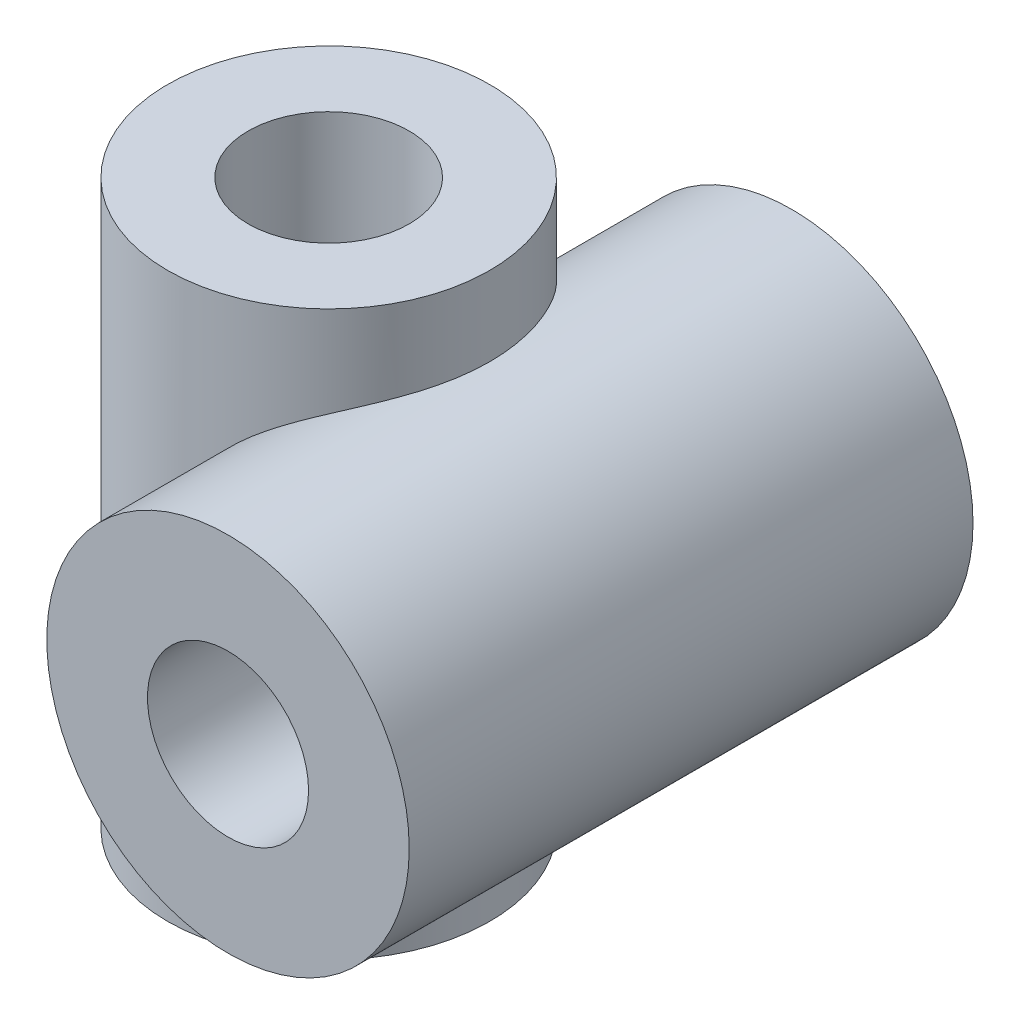
ISO-10303-21;
HEADER;
FILE_DESCRIPTION(('STEP AP214'),'2;1');
FILE_NAME('part.step','',(''),(''),'','','');
FILE_SCHEMA(('AUTOMOTIVE_DESIGN { 1 0 10303 214 1 1 1 1 }'));
ENDSEC;
DATA;
#1=APPLICATION_CONTEXT('core data for automotive mechanical design processes');
#2=APPLICATION_PROTOCOL_DEFINITION('international standard','automotive_design',2000,#1);
#3=PRODUCT_CONTEXT('',#1,'mechanical');
#4=PRODUCT('Part','Part','',(#3));
#5=PRODUCT_RELATED_PRODUCT_CATEGORY('part','',(#4));
#6=PRODUCT_DEFINITION_FORMATION('','',#4);
#7=PRODUCT_DEFINITION_CONTEXT('part definition',#1,'design');
#8=PRODUCT_DEFINITION('design','',#6,#7);
#9=PRODUCT_DEFINITION_SHAPE('','',#8);
#10=(LENGTH_UNIT() NAMED_UNIT(*) SI_UNIT(.MILLI.,.METRE.));
#11=(NAMED_UNIT(*) PLANE_ANGLE_UNIT() SI_UNIT($,.RADIAN.));
#12=(NAMED_UNIT(*) SI_UNIT($,.STERADIAN.) SOLID_ANGLE_UNIT());
#13=UNCERTAINTY_MEASURE_WITH_UNIT(LENGTH_MEASURE(1.E-05),#10,'distance_accuracy_value','');
#14=(GEOMETRIC_REPRESENTATION_CONTEXT(3) GLOBAL_UNCERTAINTY_ASSIGNED_CONTEXT((#13)) GLOBAL_UNIT_ASSIGNED_CONTEXT((#10,
#11,#12)) REPRESENTATION_CONTEXT('',''));
#15=CARTESIAN_POINT('',(0.,0.,0.));
#16=DIRECTION('',(0.,0.,1.));
#17=DIRECTION('',(1.,0.,0.));
#18=AXIS2_PLACEMENT_3D('',#15,#16,#17);
#19=CARTESIAN_POINT('',(5.3483924371836,42.5780961405475,-8.07880446123565E-06));
#20=DIRECTION('',(0.,1.,0.));
#21=DIRECTION('',(0.,0.,1.));
#22=AXIS2_PLACEMENT_3D('',#19,#20,#21);
#23=PLANE('',#22);
#24=CARTESIAN_POINT('',(5.3483924371836,42.5780961405475,-8.07880446123565E-06));
#25=DIRECTION('',(0.,1.,0.));
#26=DIRECTION('',(0.,0.,1.));
#27=AXIS2_PLACEMENT_3D('',#24,#25,#26);
#28=CIRCLE('',#27,8.);
#29=CARTESIAN_POINT('',(5.3483924371836,42.5780961405475,7.99999192119554));
#30=VERTEX_POINT('',#29);
#31=EDGE_CURVE('E10',#30,#30,#28,.T.);
#32=ORIENTED_EDGE('',*,*,#31,.T.);
#33=EDGE_LOOP('',(#32));
#34=FACE_BOUND('',#33,.T.);
#35=CARTESIAN_POINT('',(5.3483924371836,42.5780961405475,-8.07880446123565E-06));
#36=DIRECTION('',(0.,1.,0.));
#37=DIRECTION('',(0.,0.,1.));
#38=AXIS2_PLACEMENT_3D('',#35,#36,#37);
#39=CIRCLE('',#38,4.);
#40=CARTESIAN_POINT('',(5.3483924371836,42.5780961405475,3.99999192119554));
#41=VERTEX_POINT('',#40);
#42=EDGE_CURVE('E50',#41,#41,#39,.T.);
#43=ORIENTED_EDGE('',*,*,#42,.F.);
#44=EDGE_LOOP('',(#43));
#45=FACE_BOUND('',#44,.T.);
#46=ADVANCED_FACE('F36',(#34,#45),#23,.T.);
#47=CARTESIAN_POINT('',(5.3483924371836,14.5780961405475,-8.07880446123565E-06));
#48=DIRECTION('',(0.,1.,0.));
#49=DIRECTION('',(0.,0.,1.));
#50=AXIS2_PLACEMENT_3D('',#47,#48,#49);
#51=PLANE('',#50);
#52=CARTESIAN_POINT('',(5.3483924371836,14.5780961405475,-8.07880446123565E-06));
#53=DIRECTION('',(0.,1.,0.));
#54=DIRECTION('',(0.,0.,1.));
#55=AXIS2_PLACEMENT_3D('',#52,#53,#54);
#56=CIRCLE('',#55,8.);
#57=CARTESIAN_POINT('',(5.3483924371836,14.5780961405475,7.99999192119554));
#58=VERTEX_POINT('',#57);
#59=EDGE_CURVE('E41',#58,#58,#56,.T.);
#60=ORIENTED_EDGE('',*,*,#59,.F.);
#61=EDGE_LOOP('',(#60));
#62=FACE_BOUND('',#61,.T.);
#63=CARTESIAN_POINT('',(5.3483924371836,14.5780961405475,-8.07880446123565E-06));
#64=DIRECTION('',(0.,1.,0.));
#65=DIRECTION('',(0.,0.,1.));
#66=AXIS2_PLACEMENT_3D('',#63,#64,#65);
#67=CIRCLE('',#66,4.);
#68=CARTESIAN_POINT('',(5.3483924371836,14.5780961405475,3.99999192119554));
#69=VERTEX_POINT('',#68);
#70=EDGE_CURVE('E52',#69,#69,#67,.T.);
#71=ORIENTED_EDGE('',*,*,#70,.T.);
#72=EDGE_LOOP('',(#71));
#73=FACE_BOUND('',#72,.T.);
#74=ADVANCED_FACE('F83',(#62,#73),#51,.F.);
#75=CARTESIAN_POINT('',(5.3483924371836,42.5780961405475,-8.07880446123565E-06));
#76=DIRECTION('',(0.,-1.,0.));
#77=DIRECTION('',(0.,0.,-1.));
#78=AXIS2_PLACEMENT_3D('',#75,#76,#77);
#79=CYLINDRICAL_SURFACE('',#78,8.);
#80=CARTESIAN_POINT('',(5.3483924371836,29.7071454982904,-8.00000807880446));
#81=CARTESIAN_POINT('',(5.34839171642206,29.4562219147602,-8.00000636246614));
#82=CARTESIAN_POINT('',(5.35889141441208,29.2053134726397,-8.00002828869413));
#83=CARTESIAN_POINT('',(5.40082152134282,28.705165610582,-7.99986412057503));
#84=CARTESIAN_POINT('',(5.43225838156215,28.4559267289951,-7.99967796209969));
#85=CARTESIAN_POINT('',(5.51592120225961,27.9605299775816,-7.99836309516809));
#86=CARTESIAN_POINT('',(5.56818242743437,27.7143780684495,-7.99723278427369));
#87=CARTESIAN_POINT('',(5.69311709161706,27.2273465032014,-7.99282162272182));
#88=CARTESIAN_POINT('',(5.76578887376979,26.9864664208476,-7.98954094659441));
#89=CARTESIAN_POINT('',(5.93116141595478,26.5112694723611,-7.97918427438733));
#90=CARTESIAN_POINT('',(6.02389807955738,26.2769652331269,-7.97210144073448));
#91=CARTESIAN_POINT('',(6.2285966678794,25.817126160975,-7.9521028214573));
#92=CARTESIAN_POINT('',(6.3405602103225,25.5915920679256,-7.93918654486576));
#93=CARTESIAN_POINT('',(6.58254246784656,25.1514273910058,-7.90518220515264));
#94=CARTESIAN_POINT('',(6.71253794198736,24.9367832500679,-7.88410459931648));
#95=CARTESIAN_POINT('',(6.98930200701063,24.5200167617577,-7.83117942185384));
#96=CARTESIAN_POINT('',(7.13606600028381,24.3178910054084,-7.79933479766994));
#97=CARTESIAN_POINT('',(7.41170801415273,23.9694840579078,-7.73036346134587));
#98=CARTESIAN_POINT('',(7.5377678516518,23.8204574935148,-7.69579364016603));
#99=CARTESIAN_POINT('',(7.79790250148544,23.5322988262593,-7.61698652429009));
#100=CARTESIAN_POINT('',(7.93197570568566,23.3931647503472,-7.57275116458793));
#101=CARTESIAN_POINT('',(8.20657532082759,23.1257486773848,-7.47343331482255));
#102=CARTESIAN_POINT('',(8.34709683116879,22.9974586430854,-7.41835896084577));
#103=CARTESIAN_POINT('',(8.632932761721,22.7523658189322,-7.29630417898708));
#104=CARTESIAN_POINT('',(8.77824725147987,22.6355631958629,-7.22932357827925));
#105=CARTESIAN_POINT('',(9.07232792004516,22.4135011825214,-7.08234115221056));
#106=CARTESIAN_POINT('',(9.22110688141814,22.3082972413465,-7.00228096581344));
#107=CARTESIAN_POINT('',(9.51923742672705,22.1103513464126,-6.82890114547947));
#108=CARTESIAN_POINT('',(9.66858901108542,22.0176094018489,-6.73558150175901));
#109=CARTESIAN_POINT('',(9.96555749830343,21.8445567924269,-6.53559010685128));
#110=CARTESIAN_POINT('',(10.1131743097095,21.7642467802613,-6.4289176551555));
#111=CARTESIAN_POINT('',(10.4043885810813,21.6156958432577,-6.20250060807725));
#112=CARTESIAN_POINT('',(10.5479861959164,21.5474544528461,-6.08275651725019));
#113=CARTESIAN_POINT('',(10.8185711676721,21.4270100934985,-5.84018505918697));
#114=CARTESIAN_POINT('',(10.9459991529363,21.37399122383,-5.71825127579675));
#115=CARTESIAN_POINT('',(11.1940993092849,21.2769509637019,-5.46436628445267));
#116=CARTESIAN_POINT('',(11.3147718650154,21.2329290605865,-5.33241564785662));
#117=CARTESIAN_POINT('',(11.5480951784636,21.1529914107292,-5.05925315297328));
#118=CARTESIAN_POINT('',(11.6607442589345,21.117077355487,-4.91803937007794));
#119=CARTESIAN_POINT('',(11.8769135760461,21.0524054892737,-4.62723642831702));
#120=CARTESIAN_POINT('',(11.9804333046131,21.0236480764275,-4.47764680406922));
#121=CARTESIAN_POINT('',(12.1831039158853,20.9708352171786,-4.16220096835483));
#122=CARTESIAN_POINT('',(12.2816634915532,20.9471441477825,-3.99590388688417));
#123=CARTESIAN_POINT('',(12.4667349660057,20.9055340326296,-3.65605030687086));
#124=CARTESIAN_POINT('',(12.5532465497104,20.8876151378111,-3.4824936186287));
#125=CARTESIAN_POINT('',(12.7135882445054,20.8564907309885,-3.12915209126873));
#126=CARTESIAN_POINT('',(12.7874145695007,20.8432866249164,-2.94936541189507));
#127=CARTESIAN_POINT('',(12.9218486254251,20.8206603124742,-2.58468134515894));
#128=CARTESIAN_POINT('',(12.9824555268567,20.8112383433959,-2.39978363790745));
#129=CARTESIAN_POINT('',(13.095382599145,20.794595425986,-2.00745041462079));
#130=CARTESIAN_POINT('',(13.1462909081611,20.7876842156918,-1.79959408335541));
#131=CARTESIAN_POINT('',(13.2313029111551,20.7766389139357,-1.38039547553114));
#132=CARTESIAN_POINT('',(13.2654056065126,20.7725049874998,-1.16905299258975));
#133=CARTESIAN_POINT('',(13.3165727809735,20.7664512283309,-0.744239687623361));
#134=CARTESIAN_POINT('',(13.3336337829463,20.7645318474339,-0.530768440222585));
#135=CARTESIAN_POINT('',(13.3505893996544,20.7626242349992,-0.103137566240787));
#136=CARTESIAN_POINT('',(13.3504838490005,20.7626360220671,0.111022066952532));
#137=CARTESIAN_POINT('',(13.3327503217692,20.764631350903,0.547380346331098));
#138=CARTESIAN_POINT('',(13.3144065181346,20.7666954430476,0.769549898632325));
#139=CARTESIAN_POINT('',(13.2592531702173,20.7732469095929,1.21155638854126));
#140=CARTESIAN_POINT('',(13.2224429501445,20.7777343726789,1.43139324048167));
#141=CARTESIAN_POINT('',(13.1306208681469,20.78979300601,1.86721601778132));
#142=CARTESIAN_POINT('',(13.0756038033016,20.7973650578726,2.08320082373654));
#143=CARTESIAN_POINT('',(12.9478051661443,20.8165590528326,2.50966815201323));
#144=CARTESIAN_POINT('',(12.8750238079646,20.8281809471134,2.72015074062505));
#145=CARTESIAN_POINT('',(12.7125390008685,20.8566786365899,3.13344163920348));
#146=CARTESIAN_POINT('',(12.6228832656167,20.8735397030427,3.3362696974154));
#147=CARTESIAN_POINT('',(12.4273476631939,20.9139919679251,3.73326762182713));
#148=CARTESIAN_POINT('',(12.321467600281,20.9375832475557,3.92743738353063));
#149=CARTESIAN_POINT('',(12.0946541709193,20.9931176311873,4.30539500176969));
#150=CARTESIAN_POINT('',(11.9737289008158,21.0250562532931,4.48918836544852));
#151=CARTESIAN_POINT('',(11.7182360820179,21.0990127128115,4.84488857436338));
#152=CARTESIAN_POINT('',(11.5836697230026,21.1410296716987,5.01679645397154));
#153=CARTESIAN_POINT('',(11.3113303874116,21.2339134284205,5.33711028045904));
#154=CARTESIAN_POINT('',(11.1742539857254,21.2840838630801,5.48631020817879));
#155=CARTESIAN_POINT('',(10.8916087607416,21.3960841585965,5.77174044602422));
#156=CARTESIAN_POINT('',(10.746040338539,21.4579134690887,5.90797136790341));
#157=CARTESIAN_POINT('',(10.4487641032262,21.5942172293074,6.16643110173855));
#158=CARTESIAN_POINT('',(10.2970616120047,21.6686808895208,6.28867171325195));
#159=CARTESIAN_POINT('',(9.98989885909922,21.8309987854136,6.51867454409352));
#160=CARTESIAN_POINT('',(9.83443892614786,21.9188518532178,6.62643802463142));
#161=CARTESIAN_POINT('',(9.53831715017468,22.0985943255665,6.81705266987113));
#162=CARTESIAN_POINT('',(9.39776169494478,22.1891600942551,6.90132343920021));
#163=CARTESIAN_POINT('',(9.11767095071878,22.3812747053372,7.05820004567184));
#164=CARTESIAN_POINT('',(8.97813558319263,22.4828226925686,7.13080678997469));
#165=CARTESIAN_POINT('',(8.70188136406185,22.6966228730944,7.26481770576418));
#166=CARTESIAN_POINT('',(8.5651630692825,22.8088771583866,7.3262196809957));
#167=CARTESIAN_POINT('',(8.29623212118347,23.0435721111035,7.43850525813268));
#168=CARTESIAN_POINT('',(8.16401965026332,23.1660131902093,7.48938843464978));
#169=CARTESIAN_POINT('',(7.90463017079004,23.4213449372015,7.58186171345294));
#170=CARTESIAN_POINT('',(7.77749644148894,23.5543047074454,7.62338202225101));
#171=CARTESIAN_POINT('',(7.53054281564095,23.8291305092311,7.69770925462281));
#172=CARTESIAN_POINT('',(7.41072287928269,23.970996492285,7.73051622562935));
#173=CARTESIAN_POINT('',(7.17938835503575,24.2628759603478,7.78855295896289));
#174=CARTESIAN_POINT('',(7.06787630196086,24.4128919080424,7.8137804157708));
#175=CARTESIAN_POINT('',(6.854013548556,24.7202280931479,7.85779230260058));
#176=CARTESIAN_POINT('',(6.75166388946926,24.8775491576578,7.8765760010187));
#177=CARTESIAN_POINT('',(6.54303031978676,25.2213618653835,7.91109492283719));
#178=CARTESIAN_POINT('',(6.43823068186047,25.4088363044875,7.92602547074816));
#179=CARTESIAN_POINT('',(6.24218689347192,25.7910783588386,7.95051975343611));
#180=CARTESIAN_POINT('',(6.15094375202873,25.9858465156125,7.96008308887486));
#181=CARTESIAN_POINT('',(5.9825535794889,26.3816362827761,7.97526574282123));
#182=CARTESIAN_POINT('',(5.90541317399653,26.5826607808222,7.98088321102597));
#183=CARTESIAN_POINT('',(5.76572348263307,26.9897723976789,7.98940553153086));
#184=CARTESIAN_POINT('',(5.70317488533951,27.1958597548955,7.9923102558379));
#185=CARTESIAN_POINT('',(5.58556545942583,27.6401315233476,7.99672134993238));
#186=CARTESIAN_POINT('',(5.53265744954131,27.8788911407981,7.99798582224655));
#187=CARTESIAN_POINT('',(5.44644031604454,28.359937130931,7.99950718356422));
#188=CARTESIAN_POINT('',(5.41313277974092,28.6022237876165,7.99976399097334));
#189=CARTESIAN_POINT('',(5.36633859362346,29.0887341283399,8.00000619197714));
#190=CARTESIAN_POINT('',(5.35285420479711,29.3329580301425,7.99999155461397));
#191=CARTESIAN_POINT('',(5.34580338899367,29.8216901499337,7.99999217819643));
#192=CARTESIAN_POINT('',(5.35223693247146,30.0661983675001,8.00000743909771));
#193=CARTESIAN_POINT('',(5.38554417550573,30.562281318982,7.99992390222892));
#194=CARTESIAN_POINT('',(5.41311377432951,30.8138096186937,7.99982116064531));
#195=CARTESIAN_POINT('',(5.48932762232193,31.3136603615412,7.99884092077572));
#196=CARTESIAN_POINT('',(5.53797273441221,31.5619826729813,7.99796339076507));
#197=CARTESIAN_POINT('',(5.65602813166817,32.0538023416555,7.99429284347873));
#198=CARTESIAN_POINT('',(5.72545194054427,32.2972964460896,7.99149857717009));
#199=CARTESIAN_POINT('',(5.88454004591249,32.7775165057359,7.98240315570943));
#200=CARTESIAN_POINT('',(5.9742039679572,33.0142425860672,7.97610206543142));
#201=CARTESIAN_POINT('',(6.17287086831282,33.4786851379087,7.95801680472287));
#202=CARTESIAN_POINT('',(6.28183565278214,33.7064183362031,7.94624338990589));
#203=CARTESIAN_POINT('',(6.51827441095229,34.1515525431873,7.914888681628));
#204=CARTESIAN_POINT('',(6.64574968520039,34.3689528244605,7.89530683937793));
#205=CARTESIAN_POINT('',(6.91768195956938,34.7911896060167,7.84578040623181));
#206=CARTESIAN_POINT('',(7.06211379000729,34.996044057925,7.81585104951506));
#207=CARTESIAN_POINT('',(7.36628708638566,35.3915426206992,7.74289373518346));
#208=CARTESIAN_POINT('',(7.52602345581754,35.5821914247991,7.69987012772092));
#209=CARTESIAN_POINT('',(7.81886476492731,35.9039787263149,7.61013788488701));
#210=CARTESIAN_POINT('',(7.94928439273116,36.0384970448708,7.56673131593591));
#211=CARTESIAN_POINT('',(8.2162258465631,36.2973711012218,7.46964314715584));
#212=CARTESIAN_POINT('',(8.35274641433826,36.4217289196835,7.41596365857792));
#213=CARTESIAN_POINT('',(8.63019504215195,36.6595248848458,7.29742344224328));
#214=CARTESIAN_POINT('',(8.77111989130425,36.7729707515819,7.23257071140963));
#215=CARTESIAN_POINT('',(9.05563911925519,36.9885338323443,7.09094163553733));
#216=CARTESIAN_POINT('',(9.1992335600635,37.090650782836,7.0141650132234));
#217=CARTESIAN_POINT('',(9.48750526557546,37.2835525923227,6.84802053224263));
#218=CARTESIAN_POINT('',(9.63218446747004,37.3743035061086,6.75861657725512));
#219=CARTESIAN_POINT('',(9.92010870692463,37.5441247303068,6.56728084544025));
#220=CARTESIAN_POINT('',(10.0633537422502,37.6231950225229,6.46534904909753));
#221=CARTESIAN_POINT('',(10.3463718407375,37.769977296199,6.24914551108288));
#222=CARTESIAN_POINT('',(10.4861439575403,37.8376862100206,6.13487045030396));
#223=CARTESIAN_POINT('',(10.7602241711963,37.9623086262026,5.89450627616808));
#224=CARTESIAN_POINT('',(10.8945323230095,38.0192222371698,5.768417281685));
#225=CARTESIAN_POINT('',(11.1502572928609,38.1208272032128,5.51087737427998));
#226=CARTESIAN_POINT('',(11.2719806072314,38.1659417444613,5.37989653151604));
#227=CARTESIAN_POINT('',(11.5074989561496,38.2479227131723,5.1085804844462));
#228=CARTESIAN_POINT('',(11.621294270389,38.2847894317109,4.96824561048288));
#229=CARTESIAN_POINT('',(11.8398678206797,38.3512394003367,4.67905258732803));
#230=CARTESIAN_POINT('',(11.9446442431595,38.3808211877425,4.53019273385902));
#231=CARTESIAN_POINT('',(12.1442481508581,38.4336803505669,4.22487284334607));
#232=CARTESIAN_POINT('',(12.239074792051,38.4569571914102,4.06841216317903));
#233=CARTESIAN_POINT('',(12.4251562384558,38.4998126441691,3.73609982497681));
#234=CARTESIAN_POINT('',(12.5155267812961,38.5189497452935,3.55969574150119));
#235=CARTESIAN_POINT('',(12.6830725402239,38.552144411524,3.20027166159289));
#236=CARTESIAN_POINT('',(12.7602472163977,38.5662017688167,3.01725139482758));
#237=CARTESIAN_POINT('',(12.9008596033988,38.5902609874792,2.64568827619581));
#238=CARTESIAN_POINT('',(12.9642931033811,38.6002616065193,2.45714375151347));
#239=CARTESIAN_POINT('',(13.0769690595337,38.6170684320048,2.07572181685561));
#240=CARTESIAN_POINT('',(13.1262109572913,38.6238745127579,1.88284423670439));
#241=CARTESIAN_POINT('',(13.2139782030198,38.6354850760428,1.47633936808432));
#242=CARTESIAN_POINT('',(13.2511371205124,38.640053777678,1.26240911657369));
#243=CARTESIAN_POINT('',(13.3079480572636,38.646848667938,0.832193804594957));
#244=CARTESIAN_POINT('',(13.3275990753473,38.6490747226019,0.615908610177122));
#245=CARTESIAN_POINT('',(13.3492570052195,38.6515207460753,0.182401134284828));
#246=CARTESIAN_POINT('',(13.3512604188153,38.6517403171504,-0.0348213244412117));
#247=CARTESIAN_POINT('',(13.3376000025548,38.6502067413974,-0.468702230296986));
#248=CARTESIAN_POINT('',(13.3219361059766,38.6484535871193,-0.685360675293587));
#249=CARTESIAN_POINT('',(13.2723549900226,38.6426246084947,-1.12278536601292));
#250=CARTESIAN_POINT('',(13.2379323312187,38.638484275449,-1.34349367675914));
#251=CARTESIAN_POINT('',(13.1507746580742,38.6272149702583,-1.78119531798927));
#252=CARTESIAN_POINT('',(13.0980390867242,38.620085907206,-1.99818853526341));
#253=CARTESIAN_POINT('',(12.9746550060924,38.6019041987442,-2.4269169673178));
#254=CARTESIAN_POINT('',(12.9040020754003,38.5908505846159,-2.63865087009328));
#255=CARTESIAN_POINT('',(12.7453843995784,38.5636028406666,-3.055195753345));
#256=CARTESIAN_POINT('',(12.6574200022241,38.547408814109,-3.26000687279839));
#257=CARTESIAN_POINT('',(12.4660745932372,38.5086394061747,-3.65882803929305));
#258=CARTESIAN_POINT('',(12.3628780555631,38.4861378273899,-3.85293364282809));
#259=CARTESIAN_POINT('',(12.1414018355019,38.4330925283119,-4.23120778371541));
#260=CARTESIAN_POINT('',(12.0231220908394,38.4025487748138,-4.41537628003501));
#261=CARTESIAN_POINT('',(11.7729594695925,38.3317626332446,-4.77204573397203));
#262=CARTESIAN_POINT('',(11.6410878067076,38.2915282041774,-4.94455611833113));
#263=CARTESIAN_POINT('',(11.3654305206719,38.1996731288487,-5.27653935213552));
#264=CARTESIAN_POINT('',(11.2216461941729,38.1480537207884,-5.43601361677277));
#265=CARTESIAN_POINT('',(10.9359301764979,38.0364163847016,-5.7287027273045));
#266=CARTESIAN_POINT('',(10.7947245500338,37.977364222446,-5.86299527645552));
#267=CARTESIAN_POINT('',(10.5060867590496,37.8472764056033,-6.11844915049151));
#268=CARTESIAN_POINT('',(10.3586549709742,37.7762414747396,-6.23961126768991));
#269=CARTESIAN_POINT('',(10.0599380632497,37.6215266114663,-6.46813663512943));
#270=CARTESIAN_POINT('',(9.90865518222899,37.5378538918387,-6.57550769209235));
#271=CARTESIAN_POINT('',(9.60460098049157,37.3574835942291,-6.77628115778012));
#272=CARTESIAN_POINT('',(9.45182974308052,37.2607867413869,-6.86968434357842));
#273=CARTESIAN_POINT('',(9.16112675437919,37.0637920664587,-7.03480868020938));
#274=CARTESIAN_POINT('',(9.02310887778123,36.9646213202663,-7.10772912380363));
#275=CARTESIAN_POINT('',(8.74965938526289,36.7558173435438,-7.24256435114236));
#276=CARTESIAN_POINT('',(8.61422758652465,36.6461848558975,-7.30447991544605));
#277=CARTESIAN_POINT('',(8.34754699598902,36.4168985214172,-7.41796484482075));
#278=CARTESIAN_POINT('',(8.21629900422587,36.2972427736017,-7.4695322409633));
#279=CARTESIAN_POINT('',(7.95943878399101,36.0485361445999,-7.5631508447125));
#280=CARTESIAN_POINT('',(7.83382685431788,35.9194847662487,-7.60520154826384));
#281=CARTESIAN_POINT('',(7.5843140351708,35.647076466526,-7.68235289197515));
#282=CARTESIAN_POINT('',(7.46070794703575,35.5033459771794,-7.71708629179338));
#283=CARTESIAN_POINT('',(7.22207785865518,35.2073085981578,-7.77847104956397));
#284=CARTESIAN_POINT('',(7.10705403315795,35.055001533961,-7.80512224298382));
#285=CARTESIAN_POINT('',(6.88642450935034,34.7425829154792,-7.85157973552596));
#286=CARTESIAN_POINT('',(6.78082476497096,34.5824665248319,-7.87138172987147));
#287=CARTESIAN_POINT('',(6.5798318878882,34.2553679228986,-7.90531935049564));
#288=CARTESIAN_POINT('',(6.48443986290081,34.0883849691867,-7.91945436226383));
#289=CARTESIAN_POINT('',(6.29052003303023,33.7221176841615,-7.94503115605428));
#290=CARTESIAN_POINT('',(6.19378546575001,33.5218292160905,-7.9557192444367));
#291=CARTESIAN_POINT('',(6.01534833456985,33.1144671851574,-7.97266157271936));
#292=CARTESIAN_POINT('',(5.93364798118967,32.9073926297838,-7.97891516098858));
#293=CARTESIAN_POINT('',(5.78584925836127,32.4878434924194,-7.9883818989438));
#294=CARTESIAN_POINT('',(5.71974005434644,32.2753727747263,-7.99159716471375));
#295=CARTESIAN_POINT('',(5.60344863881753,31.8461632472248,-7.99615236134257));
#296=CARTESIAN_POINT('',(5.55326294619224,31.6294253812959,-7.99749270230598));
#297=CARTESIAN_POINT('',(5.45708042366249,31.1305770732028,-7.99945591208013));
#298=CARTESIAN_POINT('',(5.41635052520184,30.8474342569169,-7.99976557793215));
#299=CARTESIAN_POINT('',(5.36200698625589,30.2785695777531,-8.00004263785297));
#300=CARTESIAN_POINT('',(5.34839325784451,29.992847723241,-8.00001003303161));
#301=CARTESIAN_POINT('',(5.3483924371836,29.7071454982904,-8.00000807880446));
#302=B_SPLINE_CURVE_WITH_KNOTS('',3,(#80,#81,#82,#83,#84,#85,#86,#87,#88,#89,#90,#91,#92,#93,
#94,#95,#96,#97,#98,#99,#100,#101,#102,#103,#104,#105,#106,#107,#108,#109,#110,#111,#112,#113,
#114,#115,#116,#117,#118,#119,#120,#121,#122,#123,#124,#125,#126,#127,#128,#129,#130,#131,#132,
#133,#134,#135,#136,#137,#138,#139,#140,#141,#142,#143,#144,#145,#146,#147,#148,#149,#150,#151,
#152,#153,#154,#155,#156,#157,#158,#159,#160,#161,#162,#163,#164,#165,#166,#167,#168,#169,#170,
#171,#172,#173,#174,#175,#176,#177,#178,#179,#180,#181,#182,#183,#184,#185,#186,#187,#188,#189,
#190,#191,#192,#193,#194,#195,#196,#197,#198,#199,#200,#201,#202,#203,#204,#205,#206,#207,#208,
#209,#210,#211,#212,#213,#214,#215,#216,#217,#218,#219,#220,#221,#222,#223,#224,#225,#226,#227,
#228,#229,#230,#231,#232,#233,#234,#235,#236,#237,#238,#239,#240,#241,#242,#243,#244,#245,#246,
#247,#248,#249,#250,#251,#252,#253,#254,#255,#256,#257,#258,#259,#260,#261,#262,#263,#264,#265,
#266,#267,#268,#269,#270,#271,#272,#273,#274,#275,#276,#277,#278,#279,#280,#281,#282,#283,#284,
#285,#286,#287,#288,#289,#290,#291,#292,#293,#294,#295,#296,#297,#298,#299,#300,#301),
.UNSPECIFIED.,.T.,.F.,(4,2,2,2,2,2,2,2,2,2,2,2,2,2,2,2,2,2,2,2,2,2,2,2,2,2,2,2,2,2,2,2,2,2,2,2,
2,2,2,2,2,2,2,2,2,2,2,2,2,2,2,2,2,2,2,2,2,2,2,2,2,2,2,2,2,2,2,2,2,2,2,2,2,2,2,2,2,2,2,2,2,2,2,2,
2,2,2,2,2,2,2,2,2,2,2,2,2,2,2,2,2,2,2,2,2,2,2,2,2,2,4),(0.,0.752525348086257,1.5052826759434,
2.25932020367236,3.01329653904458,3.76863334518764,4.52403373551831,5.27846940119415,
6.03269870910193,6.62679609416395,7.22077465260378,7.81430904118585,8.40785204595964,
9.0041196412887,9.60038767658132,10.1966870061181,10.7929633270838,11.3448378649096,
11.8966809476236,12.4486390524268,13.0006278558617,13.5842825621574,14.1679525293722,
14.7517963996872,15.335676894733,15.977288636741,16.618938499894,17.2607192564261,
17.9025061961237,18.5705179043831,19.2385540607313,19.9067812850358,20.5750004548694,
21.2413578193332,21.9077232238374,22.5737315726592,23.2396818868329,23.865000755485,
24.4902901129498,25.1150481474252,25.7397517192728,26.3007951172718,26.8617948594181,
27.4229044457025,27.9840367192559,28.5492228877277,29.1144059794314,29.679760813573,
30.2451798150684,30.8904178342529,31.5357038549004,32.1812922625488,32.8269111289171,
33.5597420796132,34.2926323691242,35.0256062441127,35.7585790318497,36.516779685418,
37.2750113858978,38.0337376547751,38.7924498881671,39.5496771710859,40.30695768257,
41.063127998633,41.8190473746403,42.3954336445828,42.9717015847929,43.5475587785123,
44.123429365081,44.7009807605224,45.2785330556615,45.8562410432226,46.4339432184077,
46.9865778416198,47.5391929585772,48.0919189402823,48.6446917711127,49.2414388843413,
49.838210407861,50.4351645481123,51.032142174169,51.682941705129,52.3337784491419,
52.9847442022298,53.6357124137434,54.3051560857486,54.9746201214809,55.6442495197726,
56.3138654670403,56.975951928257,57.6380411231772,58.2995883839068,58.9610637318926,
59.571079643396,60.1810587249436,60.7906909787048,61.4002893042171,61.9544532699171,
62.5085779139169,63.062807890518,63.6170672152586,64.1946667527407,64.7722780478445,
65.3502517194272,65.9282880477875,66.5956460002428,67.2631019978167,67.9300927925843,
68.5969376728353,69.4537677101124,70.3105949690537),.UNSPECIFIED.);
#303=CARTESIAN_POINT('',(5.3483924371836,29.7071454982904,-8.00000807880446));
#304=VERTEX_POINT('',#303);
#305=EDGE_CURVE('E56',#304,#304,#302,.T.);
#306=ORIENTED_EDGE('',*,*,#305,.T.);
#307=EDGE_LOOP('',(#306));
#308=FACE_BOUND('',#307,.T.);
#309=ORIENTED_EDGE('',*,*,#31,.F.);
#310=EDGE_LOOP('',(#309));
#311=FACE_BOUND('',#310,.T.);
#312=ORIENTED_EDGE('',*,*,#59,.T.);
#313=EDGE_LOOP('',(#312));
#314=FACE_BOUND('',#313,.T.);
#315=ADVANCED_FACE('F38',(#308,#311,#314),#79,.T.);
#316=CARTESIAN_POINT('',(5.3483924371836,42.5780961405475,-8.07880446123565E-06));
#317=DIRECTION('',(0.,-1.,0.));
#318=DIRECTION('',(0.,0.,-1.));
#319=AXIS2_PLACEMENT_3D('',#316,#317,#318);
#320=CYLINDRICAL_SURFACE('',#319,4.);
#321=ORIENTED_EDGE('',*,*,#42,.T.);
#322=EDGE_LOOP('',(#321));
#323=FACE_BOUND('',#322,.T.);
#324=ORIENTED_EDGE('',*,*,#70,.F.);
#325=EDGE_LOOP('',(#324));
#326=FACE_BOUND('',#325,.T.);
#327=ADVANCED_FACE('F78',(#323,#326),#320,.F.);
#328=CARTESIAN_POINT('',(14.3483924371836,29.7071454982904,-14.0000080788045));
#329=DIRECTION('',(0.,0.,1.));
#330=DIRECTION('',(1.,0.,0.));
#331=AXIS2_PLACEMENT_3D('',#328,#329,#330);
#332=CYLINDRICAL_SURFACE('',#331,4.);
#333=CARTESIAN_POINT('',(14.3483924371836,29.7071454982904,13.9999919211955));
#334=DIRECTION('',(0.,0.,1.));
#335=DIRECTION('',(1.,0.,0.));
#336=AXIS2_PLACEMENT_3D('',#333,#334,#335);
#337=CIRCLE('',#336,4.);
#338=CARTESIAN_POINT('',(18.3483924371836,29.7071454982904,13.9999919211955));
#339=VERTEX_POINT('',#338);
#340=EDGE_CURVE('E164',#339,#339,#337,.T.);
#341=ORIENTED_EDGE('',*,*,#340,.T.);
#342=EDGE_LOOP('',(#341));
#343=FACE_BOUND('',#342,.T.);
#344=CARTESIAN_POINT('',(14.3483924371836,29.7071454982904,-14.0000080788045));
#345=DIRECTION('',(0.,0.,1.));
#346=DIRECTION('',(1.,0.,0.));
#347=AXIS2_PLACEMENT_3D('',#344,#345,#346);
#348=CIRCLE('',#347,4.);
#349=CARTESIAN_POINT('',(18.3483924371836,29.7071454982904,-14.0000080788045));
#350=VERTEX_POINT('',#349);
#351=EDGE_CURVE('E168',#350,#350,#348,.T.);
#352=ORIENTED_EDGE('',*,*,#351,.F.);
#353=EDGE_LOOP('',(#352));
#354=FACE_BOUND('',#353,.T.);
#355=ADVANCED_FACE('F75',(#343,#354),#332,.F.);
#356=CARTESIAN_POINT('',(14.3483924371836,29.7071454982904,-14.0000080788045));
#357=DIRECTION('',(0.,0.,1.));
#358=DIRECTION('',(1.,0.,0.));
#359=AXIS2_PLACEMENT_3D('',#356,#357,#358);
#360=CYLINDRICAL_SURFACE('',#359,9.00000000000001);
#361=CARTESIAN_POINT('',(14.3483924371836,29.7071454982904,-14.0000080788045));
#362=DIRECTION('',(0.,0.,1.));
#363=DIRECTION('',(1.,0.,0.));
#364=AXIS2_PLACEMENT_3D('',#361,#362,#363);
#365=CIRCLE('',#364,9.00000000000001);
#366=CARTESIAN_POINT('',(23.3483924371836,29.7071454982904,-14.0000080788045));
#367=VERTEX_POINT('',#366);
#368=EDGE_CURVE('E67',#367,#367,#365,.T.);
#369=ORIENTED_EDGE('',*,*,#368,.T.);
#370=EDGE_LOOP('',(#369));
#371=FACE_BOUND('',#370,.T.);
#372=CARTESIAN_POINT('',(14.3483924371836,29.7071454982904,13.9999919211955));
#373=DIRECTION('',(0.,0.,1.));
#374=DIRECTION('',(1.,0.,0.));
#375=AXIS2_PLACEMENT_3D('',#372,#373,#374);
#376=CIRCLE('',#375,9.00000000000001);
#377=CARTESIAN_POINT('',(23.3483924371836,29.7071454982904,13.9999919211955));
#378=VERTEX_POINT('',#377);
#379=EDGE_CURVE('E161',#378,#378,#376,.T.);
#380=ORIENTED_EDGE('',*,*,#379,.F.);
#381=EDGE_LOOP('',(#380));
#382=FACE_BOUND('',#381,.T.);
#383=ORIENTED_EDGE('',*,*,#305,.F.);
#384=EDGE_LOOP('',(#383));
#385=FACE_BOUND('',#384,.T.);
#386=ADVANCED_FACE('F69',(#371,#382,#385),#360,.T.);
#387=CARTESIAN_POINT('',(14.3483924371836,29.7071454982904,-14.0000080788045));
#388=DIRECTION('',(0.,0.,1.));
#389=DIRECTION('',(1.,0.,0.));
#390=AXIS2_PLACEMENT_3D('',#387,#388,#389);
#391=PLANE('',#390);
#392=ORIENTED_EDGE('',*,*,#351,.T.);
#393=EDGE_LOOP('',(#392));
#394=FACE_BOUND('',#393,.T.);
#395=ORIENTED_EDGE('',*,*,#368,.F.);
#396=EDGE_LOOP('',(#395));
#397=FACE_BOUND('',#396,.T.);
#398=ADVANCED_FACE('F74',(#394,#397),#391,.F.);
#399=CARTESIAN_POINT('',(14.3483924371836,29.7071454982904,13.9999919211955));
#400=DIRECTION('',(0.,0.,1.));
#401=DIRECTION('',(1.,0.,0.));
#402=AXIS2_PLACEMENT_3D('',#399,#400,#401);
#403=PLANE('',#402);
#404=ORIENTED_EDGE('',*,*,#379,.T.);
#405=EDGE_LOOP('',(#404));
#406=FACE_BOUND('',#405,.T.);
#407=ORIENTED_EDGE('',*,*,#340,.F.);
#408=EDGE_LOOP('',(#407));
#409=FACE_BOUND('',#408,.T.);
#410=ADVANCED_FACE('F120',(#406,#409),#403,.T.);
#411=CLOSED_SHELL('',(#46,#74,#315,#327,#355,#386,#398,#410));
#412=MANIFOLD_SOLID_BREP('B2',#411);
#413=ADVANCED_BREP_SHAPE_REPRESENTATION('',(#18,#412),#14);
#414=SHAPE_DEFINITION_REPRESENTATION(#9,#413);
ENDSEC;
END-ISO-10303-21;
